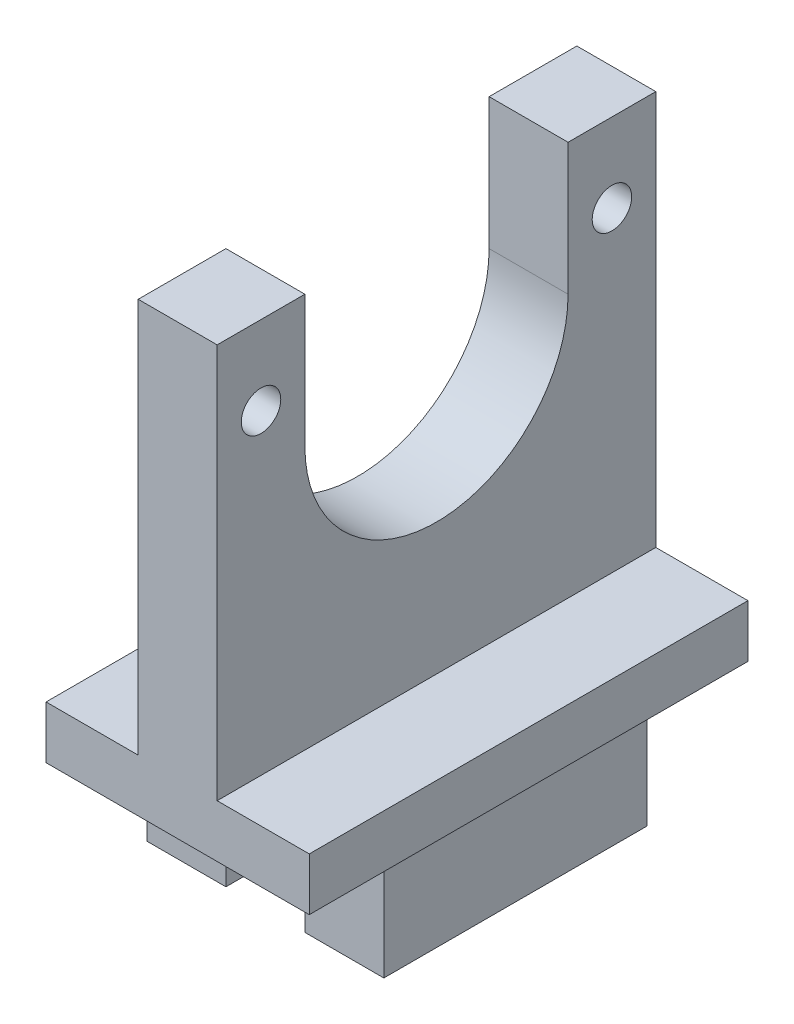
ISO-10303-21;
HEADER;
FILE_DESCRIPTION(('STEP AP214'),'2;1');
FILE_NAME('part.step','',(''),(''),'','','');
FILE_SCHEMA(('AUTOMOTIVE_DESIGN { 1 0 10303 214 1 1 1 1 }'));
ENDSEC;
DATA;
#1=APPLICATION_CONTEXT('core data for automotive mechanical design processes');
#2=APPLICATION_PROTOCOL_DEFINITION('international standard','automotive_design',2000,#1);
#3=PRODUCT_CONTEXT('',#1,'mechanical');
#4=PRODUCT('Part','Part','',(#3));
#5=PRODUCT_RELATED_PRODUCT_CATEGORY('part','',(#4));
#6=PRODUCT_DEFINITION_FORMATION('','',#4);
#7=PRODUCT_DEFINITION_CONTEXT('part definition',#1,'design');
#8=PRODUCT_DEFINITION('design','',#6,#7);
#9=PRODUCT_DEFINITION_SHAPE('','',#8);
#10=(LENGTH_UNIT() NAMED_UNIT(*) SI_UNIT(.MILLI.,.METRE.));
#11=(NAMED_UNIT(*) PLANE_ANGLE_UNIT() SI_UNIT($,.RADIAN.));
#12=(NAMED_UNIT(*) SI_UNIT($,.STERADIAN.) SOLID_ANGLE_UNIT());
#13=UNCERTAINTY_MEASURE_WITH_UNIT(LENGTH_MEASURE(1.E-05),#10,'distance_accuracy_value','');
#14=(GEOMETRIC_REPRESENTATION_CONTEXT(3) GLOBAL_UNCERTAINTY_ASSIGNED_CONTEXT((#13)) GLOBAL_UNIT_ASSIGNED_CONTEXT((#10,
#11,#12)) REPRESENTATION_CONTEXT('',''));
#15=CARTESIAN_POINT('',(0.,0.,0.));
#16=DIRECTION('',(0.,0.,1.));
#17=DIRECTION('',(1.,0.,0.));
#18=AXIS2_PLACEMENT_3D('',#15,#16,#17);
#19=CARTESIAN_POINT('',(1.5,19.,-18.6303918741117));
#20=DIRECTION('',(0.,1.,0.));
#21=DIRECTION('',(0.,0.,1.));
#22=AXIS2_PLACEMENT_3D('',#19,#20,#21);
#23=PLANE('',#22);
#24=DIRECTION('',(-1.,0.,0.));
#25=VECTOR('',#24,1.);
#26=CARTESIAN_POINT('',(1.5,19.,0.));
#27=LINE('',#26,#25);
#28=CARTESIAN_POINT('',(1.5,19.,0.));
#29=VERTEX_POINT('',#28);
#30=CARTESIAN_POINT('',(-1.5,19.,0.));
#31=VERTEX_POINT('',#30);
#32=EDGE_CURVE('E11',#29,#31,#27,.T.);
#33=ORIENTED_EDGE('',*,*,#32,.F.);
#34=DIRECTION('',(0.,0.,1.));
#35=VECTOR('',#34,1.);
#36=CARTESIAN_POINT('',(1.5,19.,-18.6303918741117));
#37=LINE('',#36,#35);
#38=CARTESIAN_POINT('',(1.5,19.,-3.33333333333333));
#39=VERTEX_POINT('',#38);
#40=EDGE_CURVE('E223',#39,#29,#37,.T.);
#41=ORIENTED_EDGE('',*,*,#40,.F.);
#42=DIRECTION('',(1.,0.,0.));
#43=VECTOR('',#42,1.);
#44=CARTESIAN_POINT('',(1.5,19.,-3.33333333333333));
#45=LINE('',#44,#43);
#46=CARTESIAN_POINT('',(-1.5,19.,-3.33333333333333));
#47=VERTEX_POINT('',#46);
#48=EDGE_CURVE('E208',#47,#39,#45,.T.);
#49=ORIENTED_EDGE('',*,*,#48,.F.);
#50=DIRECTION('',(0.,0.,1.));
#51=VECTOR('',#50,1.);
#52=CARTESIAN_POINT('',(-1.5,19.,-18.6303918741117));
#53=LINE('',#52,#51);
#54=EDGE_CURVE('E220',#47,#31,#53,.T.);
#55=ORIENTED_EDGE('',*,*,#54,.T.);
#56=EDGE_LOOP('',(#33,#41,#49,#55));
#57=FACE_BOUND('',#56,.T.);
#58=ADVANCED_FACE('F34',(#57),#23,.T.);
#59=CARTESIAN_POINT('',(0.,4.,0.));
#60=DIRECTION('',(0.,-1.,0.));
#61=DIRECTION('',(0.,0.,-1.));
#62=AXIS2_PLACEMENT_3D('',#59,#60,#61);
#63=PLANE('',#62);
#64=DIRECTION('',(0.,0.,1.));
#65=VECTOR('',#64,1.);
#66=CARTESIAN_POINT('',(-1.5,4.,-18.6303918741117));
#67=LINE('',#66,#65);
#68=CARTESIAN_POINT('',(-1.5,4.,-3.33333333333333));
#69=VERTEX_POINT('',#68);
#70=CARTESIAN_POINT('',(-1.5,4.,13.3333333333333));
#71=VERTEX_POINT('',#70);
#72=EDGE_CURVE('E57',#69,#71,#67,.T.);
#73=ORIENTED_EDGE('',*,*,#72,.F.);
#74=DIRECTION('',(-1.,0.,0.));
#75=VECTOR('',#74,1.);
#76=CARTESIAN_POINT('',(5.,4.,-3.33333333333333));
#77=LINE('',#76,#75);
#78=CARTESIAN_POINT('',(-5.,4.,-3.33333333333333));
#79=VERTEX_POINT('',#78);
#80=EDGE_CURVE('E237',#69,#79,#77,.T.);
#81=ORIENTED_EDGE('',*,*,#80,.T.);
#82=DIRECTION('',(0.,0.,1.));
#83=VECTOR('',#82,1.);
#84=CARTESIAN_POINT('',(-5.,4.,-3.33333333333333));
#85=LINE('',#84,#83);
#86=CARTESIAN_POINT('',(-5.,4.,13.3333333333333));
#87=VERTEX_POINT('',#86);
#88=EDGE_CURVE('E228',#79,#87,#85,.T.);
#89=ORIENTED_EDGE('',*,*,#88,.T.);
#90=DIRECTION('',(1.,0.,0.));
#91=VECTOR('',#90,1.);
#92=CARTESIAN_POINT('',(5.,4.,13.3333333333333));
#93=LINE('',#92,#91);
#94=EDGE_CURVE('E233',#87,#71,#93,.T.);
#95=ORIENTED_EDGE('',*,*,#94,.T.);
#96=EDGE_LOOP('',(#73,#81,#89,#95));
#97=FACE_BOUND('',#96,.T.);
#98=ADVANCED_FACE('F348',(#97),#63,.F.);
#99=CARTESIAN_POINT('',(-1.5,-2.,10.));
#100=DIRECTION('',(0.,1.,0.));
#101=DIRECTION('',(0.,0.,1.));
#102=AXIS2_PLACEMENT_3D('',#99,#100,#101);
#103=PLANE('',#102);
#104=DIRECTION('',(1.,0.,0.));
#105=VECTOR('',#104,1.);
#106=CARTESIAN_POINT('',(-1.5,-2.,0.));
#107=LINE('',#106,#105);
#108=CARTESIAN_POINT('',(-4.5,-2.,0.));
#109=VERTEX_POINT('',#108);
#110=CARTESIAN_POINT('',(-1.5,-2.,0.));
#111=VERTEX_POINT('',#110);
#112=EDGE_CURVE('E259',#109,#111,#107,.T.);
#113=ORIENTED_EDGE('',*,*,#112,.T.);
#114=DIRECTION('',(0.,0.,-1.));
#115=VECTOR('',#114,1.);
#116=CARTESIAN_POINT('',(-1.5,-2.,10.));
#117=LINE('',#116,#115);
#118=CARTESIAN_POINT('',(-1.5,-2.,10.));
#119=VERTEX_POINT('',#118);
#120=EDGE_CURVE('E315',#119,#111,#117,.T.);
#121=ORIENTED_EDGE('',*,*,#120,.F.);
#122=DIRECTION('',(1.,0.,0.));
#123=VECTOR('',#122,1.);
#124=CARTESIAN_POINT('',(-1.5,-2.,10.));
#125=LINE('',#124,#123);
#126=CARTESIAN_POINT('',(-4.5,-2.,10.));
#127=VERTEX_POINT('',#126);
#128=EDGE_CURVE('E260',#127,#119,#125,.T.);
#129=ORIENTED_EDGE('',*,*,#128,.F.);
#130=DIRECTION('',(0.,0.,-1.));
#131=VECTOR('',#130,1.);
#132=CARTESIAN_POINT('',(-4.5,-2.,10.));
#133=LINE('',#132,#131);
#134=EDGE_CURVE('E278',#127,#109,#133,.T.);
#135=ORIENTED_EDGE('',*,*,#134,.T.);
#136=EDGE_LOOP('',(#113,#121,#129,#135));
#137=FACE_BOUND('',#136,.T.);
#138=ADVANCED_FACE('F36',(#137),#103,.F.);
#139=CARTESIAN_POINT('',(-1.5,-2.,10.));
#140=DIRECTION('',(-1.,0.,0.));
#141=DIRECTION('',(0.,-1.,0.));
#142=AXIS2_PLACEMENT_3D('',#139,#140,#141);
#143=PLANE('',#142);
#144=DIRECTION('',(0.,1.,0.));
#145=VECTOR('',#144,1.);
#146=CARTESIAN_POINT('',(-1.5,-2.,0.));
#147=LINE('',#146,#145);
#148=CARTESIAN_POINT('',(-1.5,0.,0.));
#149=VERTEX_POINT('',#148);
#150=EDGE_CURVE('E281',#111,#149,#147,.T.);
#151=ORIENTED_EDGE('',*,*,#150,.T.);
#152=DIRECTION('',(0.,0.,-1.));
#153=VECTOR('',#152,1.);
#154=CARTESIAN_POINT('',(-1.5,0.,10.));
#155=LINE('',#154,#153);
#156=CARTESIAN_POINT('',(-1.5,0.,10.));
#157=VERTEX_POINT('',#156);
#158=EDGE_CURVE('E312',#157,#149,#155,.T.);
#159=ORIENTED_EDGE('',*,*,#158,.F.);
#160=DIRECTION('',(0.,1.,0.));
#161=VECTOR('',#160,1.);
#162=CARTESIAN_POINT('',(-1.5,-2.,10.));
#163=LINE('',#162,#161);
#164=EDGE_CURVE('E263',#119,#157,#163,.T.);
#165=ORIENTED_EDGE('',*,*,#164,.F.);
#166=ORIENTED_EDGE('',*,*,#120,.T.);
#167=EDGE_LOOP('',(#151,#159,#165,#166));
#168=FACE_BOUND('',#167,.T.);
#169=ADVANCED_FACE('F564',(#168),#143,.F.);
#170=CARTESIAN_POINT('',(-1.5,0.,10.));
#171=DIRECTION('',(0.,1.,0.));
#172=DIRECTION('',(-1.,0.,0.));
#173=AXIS2_PLACEMENT_3D('',#170,#171,#172);
#174=PLANE('',#173);
#175=DIRECTION('',(1.,0.,0.));
#176=VECTOR('',#175,1.);
#177=CARTESIAN_POINT('',(-1.5,0.,0.));
#178=LINE('',#177,#176);
#179=CARTESIAN_POINT('',(1.5,0.,0.));
#180=VERTEX_POINT('',#179);
#181=EDGE_CURVE('E283',#149,#180,#178,.T.);
#182=ORIENTED_EDGE('',*,*,#181,.T.);
#183=DIRECTION('',(0.,0.,-1.));
#184=VECTOR('',#183,1.);
#185=CARTESIAN_POINT('',(1.5,0.,10.));
#186=LINE('',#185,#184);
#187=CARTESIAN_POINT('',(1.5,0.,10.));
#188=VERTEX_POINT('',#187);
#189=EDGE_CURVE('E309',#188,#180,#186,.T.);
#190=ORIENTED_EDGE('',*,*,#189,.F.);
#191=DIRECTION('',(1.,0.,0.));
#192=VECTOR('',#191,1.);
#193=CARTESIAN_POINT('',(-1.5,0.,10.));
#194=LINE('',#193,#192);
#195=EDGE_CURVE('E266',#157,#188,#194,.T.);
#196=ORIENTED_EDGE('',*,*,#195,.F.);
#197=ORIENTED_EDGE('',*,*,#158,.T.);
#198=EDGE_LOOP('',(#182,#190,#196,#197));
#199=FACE_BOUND('',#198,.T.);
#200=ADVANCED_FACE('F554',(#199),#174,.F.);
#201=CARTESIAN_POINT('',(1.5,0.,10.));
#202=DIRECTION('',(1.,0.,0.));
#203=DIRECTION('',(0.,1.,0.));
#204=AXIS2_PLACEMENT_3D('',#201,#202,#203);
#205=PLANE('',#204);
#206=DIRECTION('',(0.,-1.,0.));
#207=VECTOR('',#206,1.);
#208=CARTESIAN_POINT('',(1.5,0.,0.));
#209=LINE('',#208,#207);
#210=CARTESIAN_POINT('',(1.5,-2.,0.));
#211=VERTEX_POINT('',#210);
#212=EDGE_CURVE('E285',#180,#211,#209,.T.);
#213=ORIENTED_EDGE('',*,*,#212,.T.);
#214=DIRECTION('',(0.,0.,-1.));
#215=VECTOR('',#214,1.);
#216=CARTESIAN_POINT('',(1.5,-2.,10.));
#217=LINE('',#216,#215);
#218=CARTESIAN_POINT('',(1.5,-2.,10.));
#219=VERTEX_POINT('',#218);
#220=EDGE_CURVE('E306',#219,#211,#217,.T.);
#221=ORIENTED_EDGE('',*,*,#220,.F.);
#222=DIRECTION('',(0.,-1.,0.));
#223=VECTOR('',#222,1.);
#224=CARTESIAN_POINT('',(1.5,0.,10.));
#225=LINE('',#224,#223);
#226=EDGE_CURVE('E268',#188,#219,#225,.T.);
#227=ORIENTED_EDGE('',*,*,#226,.F.);
#228=ORIENTED_EDGE('',*,*,#189,.T.);
#229=EDGE_LOOP('',(#213,#221,#227,#228));
#230=FACE_BOUND('',#229,.T.);
#231=ADVANCED_FACE('F544',(#230),#205,.F.);
#232=CARTESIAN_POINT('',(4.5,-2.,10.));
#233=DIRECTION('',(0.,1.,0.));
#234=DIRECTION('',(0.,0.,1.));
#235=AXIS2_PLACEMENT_3D('',#232,#233,#234);
#236=PLANE('',#235);
#237=DIRECTION('',(1.,0.,0.));
#238=VECTOR('',#237,1.);
#239=CARTESIAN_POINT('',(4.5,-2.,0.));
#240=LINE('',#239,#238);
#241=CARTESIAN_POINT('',(4.5,-2.,0.));
#242=VERTEX_POINT('',#241);
#243=EDGE_CURVE('E287',#211,#242,#240,.T.);
#244=ORIENTED_EDGE('',*,*,#243,.T.);
#245=DIRECTION('',(0.,0.,-1.));
#246=VECTOR('',#245,1.);
#247=CARTESIAN_POINT('',(4.5,-2.,10.));
#248=LINE('',#247,#246);
#249=CARTESIAN_POINT('',(4.5,-2.,10.));
#250=VERTEX_POINT('',#249);
#251=EDGE_CURVE('E303',#250,#242,#248,.T.);
#252=ORIENTED_EDGE('',*,*,#251,.F.);
#253=DIRECTION('',(1.,0.,0.));
#254=VECTOR('',#253,1.);
#255=CARTESIAN_POINT('',(4.5,-2.,10.));
#256=LINE('',#255,#254);
#257=EDGE_CURVE('E270',#219,#250,#256,.T.);
#258=ORIENTED_EDGE('',*,*,#257,.F.);
#259=ORIENTED_EDGE('',*,*,#220,.T.);
#260=EDGE_LOOP('',(#244,#252,#258,#259));
#261=FACE_BOUND('',#260,.T.);
#262=ADVANCED_FACE('F534',(#261),#236,.F.);
#263=CARTESIAN_POINT('',(4.5,2.,10.));
#264=DIRECTION('',(-1.,0.,0.));
#265=DIRECTION('',(0.,0.,1.));
#266=AXIS2_PLACEMENT_3D('',#263,#264,#265);
#267=PLANE('',#266);
#268=DIRECTION('',(0.,1.,0.));
#269=VECTOR('',#268,1.);
#270=CARTESIAN_POINT('',(4.5,2.,0.));
#271=LINE('',#270,#269);
#272=CARTESIAN_POINT('',(4.5,2.,0.));
#273=VERTEX_POINT('',#272);
#274=EDGE_CURVE('E289',#242,#273,#271,.T.);
#275=ORIENTED_EDGE('',*,*,#274,.T.);
#276=DIRECTION('',(0.,0.,-1.));
#277=VECTOR('',#276,1.);
#278=CARTESIAN_POINT('',(4.5,2.,10.));
#279=LINE('',#278,#277);
#280=CARTESIAN_POINT('',(4.5,2.,10.));
#281=VERTEX_POINT('',#280);
#282=EDGE_CURVE('E300',#281,#273,#279,.T.);
#283=ORIENTED_EDGE('',*,*,#282,.F.);
#284=DIRECTION('',(0.,1.,0.));
#285=VECTOR('',#284,1.);
#286=CARTESIAN_POINT('',(4.5,2.,10.));
#287=LINE('',#286,#285);
#288=EDGE_CURVE('E272',#250,#281,#287,.T.);
#289=ORIENTED_EDGE('',*,*,#288,.F.);
#290=ORIENTED_EDGE('',*,*,#251,.T.);
#291=EDGE_LOOP('',(#275,#283,#289,#290));
#292=FACE_BOUND('',#291,.T.);
#293=ADVANCED_FACE('F524',(#292),#267,.F.);
#294=CARTESIAN_POINT('',(-4.5,2.,10.));
#295=DIRECTION('',(1.,0.,0.));
#296=DIRECTION('',(0.,0.,-1.));
#297=AXIS2_PLACEMENT_3D('',#294,#295,#296);
#298=PLANE('',#297);
#299=DIRECTION('',(0.,-1.,0.));
#300=VECTOR('',#299,1.);
#301=CARTESIAN_POINT('',(-4.5,2.,0.));
#302=LINE('',#301,#300);
#303=CARTESIAN_POINT('',(-4.5,2.,0.));
#304=VERTEX_POINT('',#303);
#305=EDGE_CURVE('E264',#304,#109,#302,.T.);
#306=ORIENTED_EDGE('',*,*,#305,.T.);
#307=ORIENTED_EDGE('',*,*,#134,.F.);
#308=DIRECTION('',(0.,-1.,0.));
#309=VECTOR('',#308,1.);
#310=CARTESIAN_POINT('',(-4.5,2.,10.));
#311=LINE('',#310,#309);
#312=CARTESIAN_POINT('',(-4.5,2.,10.));
#313=VERTEX_POINT('',#312);
#314=EDGE_CURVE('E276',#313,#127,#311,.T.);
#315=ORIENTED_EDGE('',*,*,#314,.F.);
#316=DIRECTION('',(0.,0.,-1.));
#317=VECTOR('',#316,1.);
#318=CARTESIAN_POINT('',(-4.5,2.,10.));
#319=LINE('',#318,#317);
#320=EDGE_CURVE('E297',#313,#304,#319,.T.);
#321=ORIENTED_EDGE('',*,*,#320,.T.);
#322=EDGE_LOOP('',(#306,#307,#315,#321));
#323=FACE_BOUND('',#322,.T.);
#324=ADVANCED_FACE('F514',(#323),#298,.F.);
#325=CARTESIAN_POINT('',(0.,0.,10.));
#326=DIRECTION('',(0.,0.,1.));
#327=DIRECTION('',(1.,0.,0.));
#328=AXIS2_PLACEMENT_3D('',#325,#326,#327);
#329=PLANE('',#328);
#330=ORIENTED_EDGE('',*,*,#128,.T.);
#331=ORIENTED_EDGE('',*,*,#164,.T.);
#332=ORIENTED_EDGE('',*,*,#195,.T.);
#333=ORIENTED_EDGE('',*,*,#226,.T.);
#334=ORIENTED_EDGE('',*,*,#257,.T.);
#335=ORIENTED_EDGE('',*,*,#288,.T.);
#336=DIRECTION('',(-1.,0.,0.));
#337=VECTOR('',#336,1.);
#338=CARTESIAN_POINT('',(4.5,2.,10.));
#339=LINE('',#338,#337);
#340=EDGE_CURVE('E274',#281,#313,#339,.T.);
#341=ORIENTED_EDGE('',*,*,#340,.T.);
#342=ORIENTED_EDGE('',*,*,#314,.T.);
#343=EDGE_LOOP('',(#330,#331,#332,#333,#334,#335,#341,#342));
#344=FACE_BOUND('',#343,.T.);
#345=ADVANCED_FACE('F504',(#344),#329,.T.);
#346=CARTESIAN_POINT('',(0.,0.,0.));
#347=DIRECTION('',(0.,0.,1.));
#348=DIRECTION('',(1.,0.,0.));
#349=AXIS2_PLACEMENT_3D('',#346,#347,#348);
#350=PLANE('',#349);
#351=ORIENTED_EDGE('',*,*,#112,.F.);
#352=ORIENTED_EDGE('',*,*,#305,.F.);
#353=DIRECTION('',(-1.,0.,0.));
#354=VECTOR('',#353,1.);
#355=CARTESIAN_POINT('',(4.5,2.,0.));
#356=LINE('',#355,#354);
#357=EDGE_CURVE('E291',#273,#304,#356,.T.);
#358=ORIENTED_EDGE('',*,*,#357,.F.);
#359=ORIENTED_EDGE('',*,*,#274,.F.);
#360=ORIENTED_EDGE('',*,*,#243,.F.);
#361=ORIENTED_EDGE('',*,*,#212,.F.);
#362=ORIENTED_EDGE('',*,*,#181,.F.);
#363=ORIENTED_EDGE('',*,*,#150,.F.);
#364=EDGE_LOOP('',(#351,#352,#358,#359,#360,#361,#362,#363));
#365=FACE_BOUND('',#364,.T.);
#366=ADVANCED_FACE('F495',(#365),#350,.F.);
#367=CARTESIAN_POINT('',(-5.,4.,-3.33333333333333));
#368=DIRECTION('',(1.,0.,0.));
#369=DIRECTION('',(0.,0.,-1.));
#370=AXIS2_PLACEMENT_3D('',#367,#368,#369);
#371=PLANE('',#370);
#372=DIRECTION('',(0.,0.,1.));
#373=VECTOR('',#372,1.);
#374=CARTESIAN_POINT('',(-5.,2.,-3.33333333333333));
#375=LINE('',#374,#373);
#376=CARTESIAN_POINT('',(-5.,2.,-3.33333333333333));
#377=VERTEX_POINT('',#376);
#378=CARTESIAN_POINT('',(-5.,2.,13.3333333333333));
#379=VERTEX_POINT('',#378);
#380=EDGE_CURVE('E227',#377,#379,#375,.T.);
#381=ORIENTED_EDGE('',*,*,#380,.T.);
#382=DIRECTION('',(0.,-1.,0.));
#383=VECTOR('',#382,1.);
#384=CARTESIAN_POINT('',(-5.,4.,13.3333333333333));
#385=LINE('',#384,#383);
#386=EDGE_CURVE('E256',#87,#379,#385,.T.);
#387=ORIENTED_EDGE('',*,*,#386,.F.);
#388=ORIENTED_EDGE('',*,*,#88,.F.);
#389=DIRECTION('',(0.,-1.,0.));
#390=VECTOR('',#389,1.);
#391=CARTESIAN_POINT('',(-5.,4.,-3.33333333333333));
#392=LINE('',#391,#390);
#393=EDGE_CURVE('E240',#79,#377,#392,.T.);
#394=ORIENTED_EDGE('',*,*,#393,.T.);
#395=EDGE_LOOP('',(#381,#387,#388,#394));
#396=FACE_BOUND('',#395,.T.);
#397=ADVANCED_FACE('F351',(#396),#371,.F.);
#398=CARTESIAN_POINT('',(5.,4.,13.3333333333333));
#399=DIRECTION('',(0.,0.,-1.));
#400=DIRECTION('',(-1.,0.,0.));
#401=AXIS2_PLACEMENT_3D('',#398,#399,#400);
#402=PLANE('',#401);
#403=DIRECTION('',(1.,0.,0.));
#404=VECTOR('',#403,1.);
#405=CARTESIAN_POINT('',(5.,2.,13.3333333333333));
#406=LINE('',#405,#404);
#407=CARTESIAN_POINT('',(5.,2.,13.3333333333333));
#408=VERTEX_POINT('',#407);
#409=EDGE_CURVE('E243',#379,#408,#406,.T.);
#410=ORIENTED_EDGE('',*,*,#409,.T.);
#411=DIRECTION('',(0.,-1.,0.));
#412=VECTOR('',#411,1.);
#413=CARTESIAN_POINT('',(5.,4.,13.3333333333333));
#414=LINE('',#413,#412);
#415=CARTESIAN_POINT('',(5.,4.,13.3333333333333));
#416=VERTEX_POINT('',#415);
#417=EDGE_CURVE('E253',#416,#408,#414,.T.);
#418=ORIENTED_EDGE('',*,*,#417,.F.);
#419=CARTESIAN_POINT('',(1.5,4.,13.3333333333333));
#420=VERTEX_POINT('',#419);
#421=EDGE_CURVE('E231',#420,#416,#93,.T.);
#422=ORIENTED_EDGE('',*,*,#421,.F.);
#423=DIRECTION('',(0.,1.,0.));
#424=VECTOR('',#423,1.);
#425=CARTESIAN_POINT('',(1.5,4.,13.3333333333333));
#426=LINE('',#425,#424);
#427=CARTESIAN_POINT('',(1.5,19.,13.3333333333333));
#428=VERTEX_POINT('',#427);
#429=EDGE_CURVE('E201',#420,#428,#426,.T.);
#430=ORIENTED_EDGE('',*,*,#429,.T.);
#431=DIRECTION('',(-1.,0.,0.));
#432=VECTOR('',#431,1.);
#433=CARTESIAN_POINT('',(1.5,19.,13.3333333333333));
#434=LINE('',#433,#432);
#435=CARTESIAN_POINT('',(-1.5,19.,13.3333333333333));
#436=VERTEX_POINT('',#435);
#437=EDGE_CURVE('E211',#428,#436,#434,.T.);
#438=ORIENTED_EDGE('',*,*,#437,.T.);
#439=DIRECTION('',(0.,-1.,0.));
#440=VECTOR('',#439,1.);
#441=CARTESIAN_POINT('',(-1.5,4.,13.3333333333333));
#442=LINE('',#441,#440);
#443=EDGE_CURVE('E214',#436,#71,#442,.T.);
#444=ORIENTED_EDGE('',*,*,#443,.T.);
#445=ORIENTED_EDGE('',*,*,#94,.F.);
#446=ORIENTED_EDGE('',*,*,#386,.T.);
#447=EDGE_LOOP('',(#410,#418,#422,#430,#438,#444,#445,#446));
#448=FACE_BOUND('',#447,.T.);
#449=ADVANCED_FACE('F327',(#448),#402,.F.);
#450=CARTESIAN_POINT('',(5.,4.,-3.33333333333333));
#451=DIRECTION('',(-1.,0.,0.));
#452=DIRECTION('',(0.,0.,1.));
#453=AXIS2_PLACEMENT_3D('',#450,#451,#452);
#454=PLANE('',#453);
#455=DIRECTION('',(0.,0.,-1.));
#456=VECTOR('',#455,1.);
#457=CARTESIAN_POINT('',(5.,2.,-3.33333333333333));
#458=LINE('',#457,#456);
#459=CARTESIAN_POINT('',(5.,2.,-3.33333333333333));
#460=VERTEX_POINT('',#459);
#461=EDGE_CURVE('E245',#408,#460,#458,.T.);
#462=ORIENTED_EDGE('',*,*,#461,.T.);
#463=DIRECTION('',(0.,-1.,0.));
#464=VECTOR('',#463,1.);
#465=CARTESIAN_POINT('',(5.,4.,-3.33333333333333));
#466=LINE('',#465,#464);
#467=CARTESIAN_POINT('',(5.,4.,-3.33333333333333));
#468=VERTEX_POINT('',#467);
#469=EDGE_CURVE('E250',#468,#460,#466,.T.);
#470=ORIENTED_EDGE('',*,*,#469,.F.);
#471=DIRECTION('',(0.,0.,-1.));
#472=VECTOR('',#471,1.);
#473=CARTESIAN_POINT('',(5.,4.,-3.33333333333333));
#474=LINE('',#473,#472);
#475=EDGE_CURVE('E235',#416,#468,#474,.T.);
#476=ORIENTED_EDGE('',*,*,#475,.F.);
#477=ORIENTED_EDGE('',*,*,#417,.T.);
#478=EDGE_LOOP('',(#462,#470,#476,#477));
#479=FACE_BOUND('',#478,.T.);
#480=ADVANCED_FACE('F358',(#479),#454,.F.);
#481=CARTESIAN_POINT('',(5.,4.,-3.33333333333333));
#482=DIRECTION('',(0.,0.,1.));
#483=DIRECTION('',(1.,0.,0.));
#484=AXIS2_PLACEMENT_3D('',#481,#482,#483);
#485=PLANE('',#484);
#486=DIRECTION('',(-1.,0.,0.));
#487=VECTOR('',#486,1.);
#488=CARTESIAN_POINT('',(5.,2.,-3.33333333333333));
#489=LINE('',#488,#487);
#490=EDGE_CURVE('E232',#460,#377,#489,.T.);
#491=ORIENTED_EDGE('',*,*,#490,.T.);
#492=ORIENTED_EDGE('',*,*,#393,.F.);
#493=ORIENTED_EDGE('',*,*,#80,.F.);
#494=DIRECTION('',(0.,1.,0.));
#495=VECTOR('',#494,1.);
#496=CARTESIAN_POINT('',(-1.5,4.,-3.33333333333333));
#497=LINE('',#496,#495);
#498=EDGE_CURVE('E202',#69,#47,#497,.T.);
#499=ORIENTED_EDGE('',*,*,#498,.T.);
#500=ORIENTED_EDGE('',*,*,#48,.T.);
#501=DIRECTION('',(0.,-1.,0.));
#502=VECTOR('',#501,1.);
#503=CARTESIAN_POINT('',(1.5,4.,-3.33333333333333));
#504=LINE('',#503,#502);
#505=CARTESIAN_POINT('',(1.5,4.,-3.33333333333333));
#506=VERTEX_POINT('',#505);
#507=EDGE_CURVE('E204',#39,#506,#504,.T.);
#508=ORIENTED_EDGE('',*,*,#507,.T.);
#509=EDGE_CURVE('E238',#468,#506,#77,.T.);
#510=ORIENTED_EDGE('',*,*,#509,.F.);
#511=ORIENTED_EDGE('',*,*,#469,.T.);
#512=EDGE_LOOP('',(#491,#492,#493,#499,#500,#508,#510,#511));
#513=FACE_BOUND('',#512,.T.);
#514=ADVANCED_FACE('F338',(#513),#485,.F.);
#515=ORIENTED_EDGE('',*,*,#509,.T.);
#516=DIRECTION('',(0.,0.,1.));
#517=VECTOR('',#516,1.);
#518=CARTESIAN_POINT('',(1.5,4.,-18.6303918741117));
#519=LINE('',#518,#517);
#520=EDGE_CURVE('E205',#506,#420,#519,.T.);
#521=ORIENTED_EDGE('',*,*,#520,.T.);
#522=ORIENTED_EDGE('',*,*,#421,.T.);
#523=ORIENTED_EDGE('',*,*,#475,.T.);
#524=EDGE_LOOP('',(#515,#521,#522,#523));
#525=FACE_BOUND('',#524,.T.);
#526=ADVANCED_FACE('F333',(#525),#63,.F.);
#527=CARTESIAN_POINT('',(0.,2.,0.));
#528=DIRECTION('',(0.,-1.,0.));
#529=DIRECTION('',(0.,0.,-1.));
#530=AXIS2_PLACEMENT_3D('',#527,#528,#529);
#531=PLANE('',#530);
#532=ORIENTED_EDGE('',*,*,#320,.F.);
#533=ORIENTED_EDGE('',*,*,#340,.F.);
#534=ORIENTED_EDGE('',*,*,#282,.T.);
#535=ORIENTED_EDGE('',*,*,#357,.T.);
#536=EDGE_LOOP('',(#532,#533,#534,#535));
#537=FACE_BOUND('',#536,.T.);
#538=ORIENTED_EDGE('',*,*,#380,.F.);
#539=ORIENTED_EDGE('',*,*,#490,.F.);
#540=ORIENTED_EDGE('',*,*,#461,.F.);
#541=ORIENTED_EDGE('',*,*,#409,.F.);
#542=EDGE_LOOP('',(#538,#539,#540,#541));
#543=FACE_BOUND('',#542,.T.);
#544=ADVANCED_FACE('F355',(#537,#543),#531,.T.);
#545=CARTESIAN_POINT('',(1.5,4.,-18.6303918741117));
#546=DIRECTION('',(1.,0.,0.));
#547=DIRECTION('',(0.,1.,0.));
#548=AXIS2_PLACEMENT_3D('',#545,#546,#547);
#549=PLANE('',#548);
#550=CARTESIAN_POINT('',(1.5,16.,-1.66666666666667));
#551=DIRECTION('',(1.,0.,0.));
#552=DIRECTION('',(0.,1.,0.));
#553=AXIS2_PLACEMENT_3D('',#550,#551,#552);
#554=CIRCLE('',#553,0.750000000000001);
#555=CARTESIAN_POINT('',(1.5,16.75,-1.66666666666667));
#556=VERTEX_POINT('',#555);
#557=EDGE_CURVE('E405',#556,#556,#554,.T.);
#558=ORIENTED_EDGE('',*,*,#557,.F.);
#559=EDGE_LOOP('',(#558));
#560=FACE_BOUND('',#559,.T.);
#561=CARTESIAN_POINT('',(1.5,16.,11.6666666666667));
#562=DIRECTION('',(1.,0.,0.));
#563=DIRECTION('',(0.,1.,0.));
#564=AXIS2_PLACEMENT_3D('',#561,#562,#563);
#565=CIRCLE('',#564,0.75);
#566=CARTESIAN_POINT('',(1.5,16.75,11.6666666666667));
#567=VERTEX_POINT('',#566);
#568=EDGE_CURVE('E185',#567,#567,#565,.T.);
#569=ORIENTED_EDGE('',*,*,#568,.F.);
#570=EDGE_LOOP('',(#569));
#571=FACE_BOUND('',#570,.T.);
#572=DIRECTION('',(0.,1.,0.));
#573=VECTOR('',#572,1.);
#574=CARTESIAN_POINT('',(1.5,4.,0.));
#575=LINE('',#574,#573);
#576=CARTESIAN_POINT('',(1.5,14.,0.));
#577=VERTEX_POINT('',#576);
#578=EDGE_CURVE('E197',#577,#29,#575,.T.);
#579=ORIENTED_EDGE('',*,*,#578,.F.);
#580=CARTESIAN_POINT('',(1.5,14.,5.));
#581=DIRECTION('',(1.,0.,0.));
#582=DIRECTION('',(0.,1.,0.));
#583=AXIS2_PLACEMENT_3D('',#580,#581,#582);
#584=CIRCLE('',#583,5.);
#585=CARTESIAN_POINT('',(1.5,14.,10.));
#586=VERTEX_POINT('',#585);
#587=EDGE_CURVE('E199',#586,#577,#584,.T.);
#588=ORIENTED_EDGE('',*,*,#587,.F.);
#589=DIRECTION('',(0.,-1.,0.));
#590=VECTOR('',#589,1.);
#591=CARTESIAN_POINT('',(1.5,4.,10.));
#592=LINE('',#591,#590);
#593=CARTESIAN_POINT('',(1.5,19.,10.));
#594=VERTEX_POINT('',#593);
#595=EDGE_CURVE('E172',#594,#586,#592,.T.);
#596=ORIENTED_EDGE('',*,*,#595,.F.);
#597=EDGE_CURVE('E217',#594,#428,#37,.T.);
#598=ORIENTED_EDGE('',*,*,#597,.T.);
#599=ORIENTED_EDGE('',*,*,#429,.F.);
#600=ORIENTED_EDGE('',*,*,#520,.F.);
#601=ORIENTED_EDGE('',*,*,#507,.F.);
#602=ORIENTED_EDGE('',*,*,#40,.T.);
#603=EDGE_LOOP('',(#579,#588,#596,#598,#599,#600,#601,#602));
#604=FACE_BOUND('',#603,.T.);
#605=ADVANCED_FACE('F321',(#560,#571,#604),#549,.T.);
#606=CARTESIAN_POINT('',(-1.5,4.,-18.6303918741117));
#607=DIRECTION('',(-1.,0.,0.));
#608=DIRECTION('',(0.,-1.,0.));
#609=AXIS2_PLACEMENT_3D('',#606,#607,#608);
#610=PLANE('',#609);
#611=CARTESIAN_POINT('',(-1.5,16.,-1.66666666666667));
#612=DIRECTION('',(-1.,0.,0.));
#613=DIRECTION('',(0.,-1.,0.));
#614=AXIS2_PLACEMENT_3D('',#611,#612,#613);
#615=CIRCLE('',#614,0.750000000000001);
#616=CARTESIAN_POINT('',(-1.5,15.25,-1.66666666666667));
#617=VERTEX_POINT('',#616);
#618=EDGE_CURVE('E407',#617,#617,#615,.T.);
#619=ORIENTED_EDGE('',*,*,#618,.F.);
#620=EDGE_LOOP('',(#619));
#621=FACE_BOUND('',#620,.T.);
#622=CARTESIAN_POINT('',(-1.5,16.,11.6666666666667));
#623=DIRECTION('',(-1.,0.,0.));
#624=DIRECTION('',(0.,-1.,0.));
#625=AXIS2_PLACEMENT_3D('',#622,#623,#624);
#626=CIRCLE('',#625,0.75);
#627=CARTESIAN_POINT('',(-1.5,15.25,11.6666666666667));
#628=VERTEX_POINT('',#627);
#629=EDGE_CURVE('E409',#628,#628,#626,.T.);
#630=ORIENTED_EDGE('',*,*,#629,.F.);
#631=EDGE_LOOP('',(#630));
#632=FACE_BOUND('',#631,.T.);
#633=DIRECTION('',(0.,-1.,0.));
#634=VECTOR('',#633,1.);
#635=CARTESIAN_POINT('',(-1.5,14.,0.));
#636=LINE('',#635,#634);
#637=CARTESIAN_POINT('',(-1.5,14.,0.));
#638=VERTEX_POINT('',#637);
#639=EDGE_CURVE('E176',#31,#638,#636,.T.);
#640=ORIENTED_EDGE('',*,*,#639,.F.);
#641=ORIENTED_EDGE('',*,*,#54,.F.);
#642=ORIENTED_EDGE('',*,*,#498,.F.);
#643=ORIENTED_EDGE('',*,*,#72,.T.);
#644=ORIENTED_EDGE('',*,*,#443,.F.);
#645=CARTESIAN_POINT('',(-1.5,19.,9.99999999999999));
#646=VERTEX_POINT('',#645);
#647=EDGE_CURVE('E190',#646,#436,#53,.T.);
#648=ORIENTED_EDGE('',*,*,#647,.F.);
#649=DIRECTION('',(0.,1.,0.));
#650=VECTOR('',#649,1.);
#651=CARTESIAN_POINT('',(-1.5,14.,10.));
#652=LINE('',#651,#650);
#653=CARTESIAN_POINT('',(-1.5,14.,10.));
#654=VERTEX_POINT('',#653);
#655=EDGE_CURVE('E49',#654,#646,#652,.T.);
#656=ORIENTED_EDGE('',*,*,#655,.F.);
#657=CARTESIAN_POINT('',(-1.5,14.,5.));
#658=DIRECTION('',(-1.,0.,0.));
#659=DIRECTION('',(0.,-1.,0.));
#660=AXIS2_PLACEMENT_3D('',#657,#658,#659);
#661=CIRCLE('',#660,5.);
#662=EDGE_CURVE('E179',#638,#654,#661,.T.);
#663=ORIENTED_EDGE('',*,*,#662,.F.);
#664=EDGE_LOOP('',(#640,#641,#642,#643,#644,#648,#656,#663));
#665=FACE_BOUND('',#664,.T.);
#666=ADVANCED_FACE('F188',(#621,#632,#665),#610,.T.);
#667=DIRECTION('',(1.,0.,0.));
#668=VECTOR('',#667,1.);
#669=CARTESIAN_POINT('',(1.5,19.,10.));
#670=LINE('',#669,#668);
#671=EDGE_CURVE('E42',#646,#594,#670,.T.);
#672=ORIENTED_EDGE('',*,*,#671,.F.);
#673=ORIENTED_EDGE('',*,*,#647,.T.);
#674=ORIENTED_EDGE('',*,*,#437,.F.);
#675=ORIENTED_EDGE('',*,*,#597,.F.);
#676=EDGE_LOOP('',(#672,#673,#674,#675));
#677=FACE_BOUND('',#676,.T.);
#678=ADVANCED_FACE('F324',(#677),#23,.T.);
#679=CARTESIAN_POINT('',(5.,14.,5.));
#680=DIRECTION('',(-1.,0.,0.));
#681=DIRECTION('',(0.,-1.,0.));
#682=AXIS2_PLACEMENT_3D('',#679,#680,#681);
#683=CYLINDRICAL_SURFACE('',#682,5.);
#684=ORIENTED_EDGE('',*,*,#587,.T.);
#685=DIRECTION('',(-1.,0.,0.));
#686=VECTOR('',#685,1.);
#687=CARTESIAN_POINT('',(5.,14.,0.));
#688=LINE('',#687,#686);
#689=EDGE_CURVE('E175',#577,#638,#688,.T.);
#690=ORIENTED_EDGE('',*,*,#689,.T.);
#691=ORIENTED_EDGE('',*,*,#662,.T.);
#692=DIRECTION('',(-1.,0.,0.));
#693=VECTOR('',#692,1.);
#694=CARTESIAN_POINT('',(5.,14.,10.));
#695=LINE('',#694,#693);
#696=EDGE_CURVE('E168',#586,#654,#695,.T.);
#697=ORIENTED_EDGE('',*,*,#696,.F.);
#698=EDGE_LOOP('',(#684,#690,#691,#697));
#699=FACE_BOUND('',#698,.T.);
#700=ADVANCED_FACE('F180',(#699),#683,.F.);
#701=CARTESIAN_POINT('',(5.,14.,0.));
#702=DIRECTION('',(0.,0.,-1.));
#703=DIRECTION('',(-1.,0.,0.));
#704=AXIS2_PLACEMENT_3D('',#701,#702,#703);
#705=PLANE('',#704);
#706=ORIENTED_EDGE('',*,*,#578,.T.);
#707=ORIENTED_EDGE('',*,*,#32,.T.);
#708=ORIENTED_EDGE('',*,*,#639,.T.);
#709=ORIENTED_EDGE('',*,*,#689,.F.);
#710=EDGE_LOOP('',(#706,#707,#708,#709));
#711=FACE_BOUND('',#710,.T.);
#712=ADVANCED_FACE('F345',(#711),#705,.F.);
#713=CARTESIAN_POINT('',(5.,14.,10.));
#714=DIRECTION('',(0.,0.,1.));
#715=DIRECTION('',(1.,0.,0.));
#716=AXIS2_PLACEMENT_3D('',#713,#714,#715);
#717=PLANE('',#716);
#718=ORIENTED_EDGE('',*,*,#595,.T.);
#719=ORIENTED_EDGE('',*,*,#696,.T.);
#720=ORIENTED_EDGE('',*,*,#655,.T.);
#721=ORIENTED_EDGE('',*,*,#671,.T.);
#722=EDGE_LOOP('',(#718,#719,#720,#721));
#723=FACE_BOUND('',#722,.T.);
#724=ADVANCED_FACE('F170',(#723),#717,.F.);
#725=CARTESIAN_POINT('',(5.,16.,11.6666666666667));
#726=DIRECTION('',(-1.,0.,0.));
#727=DIRECTION('',(0.,-1.,0.));
#728=AXIS2_PLACEMENT_3D('',#725,#726,#727);
#729=CYLINDRICAL_SURFACE('',#728,0.75);
#730=ORIENTED_EDGE('',*,*,#568,.T.);
#731=EDGE_LOOP('',(#730));
#732=FACE_BOUND('',#731,.T.);
#733=ORIENTED_EDGE('',*,*,#629,.T.);
#734=EDGE_LOOP('',(#733));
#735=FACE_BOUND('',#734,.T.);
#736=ADVANCED_FACE('F391',(#732,#735),#729,.F.);
#737=CARTESIAN_POINT('',(5.,16.,-1.66666666666667));
#738=DIRECTION('',(-1.,0.,0.));
#739=DIRECTION('',(0.,-1.,0.));
#740=AXIS2_PLACEMENT_3D('',#737,#738,#739);
#741=CYLINDRICAL_SURFACE('',#740,0.750000000000001);
#742=ORIENTED_EDGE('',*,*,#557,.T.);
#743=EDGE_LOOP('',(#742));
#744=FACE_BOUND('',#743,.T.);
#745=ORIENTED_EDGE('',*,*,#618,.T.);
#746=EDGE_LOOP('',(#745));
#747=FACE_BOUND('',#746,.T.);
#748=ADVANCED_FACE('F396',(#744,#747),#741,.F.);
#749=CLOSED_SHELL('',(#58,#98,#138,#169,#200,#231,#262,#293,#324,#345,#366,#397,#449,#480,#514,
#526,#544,#605,#666,#678,#700,#712,#724,#736,#748));
#750=MANIFOLD_SOLID_BREP('B2',#749);
#751=ADVANCED_BREP_SHAPE_REPRESENTATION('',(#18,#750),#14);
#752=SHAPE_DEFINITION_REPRESENTATION(#9,#751);
ENDSEC;
END-ISO-10303-21;
